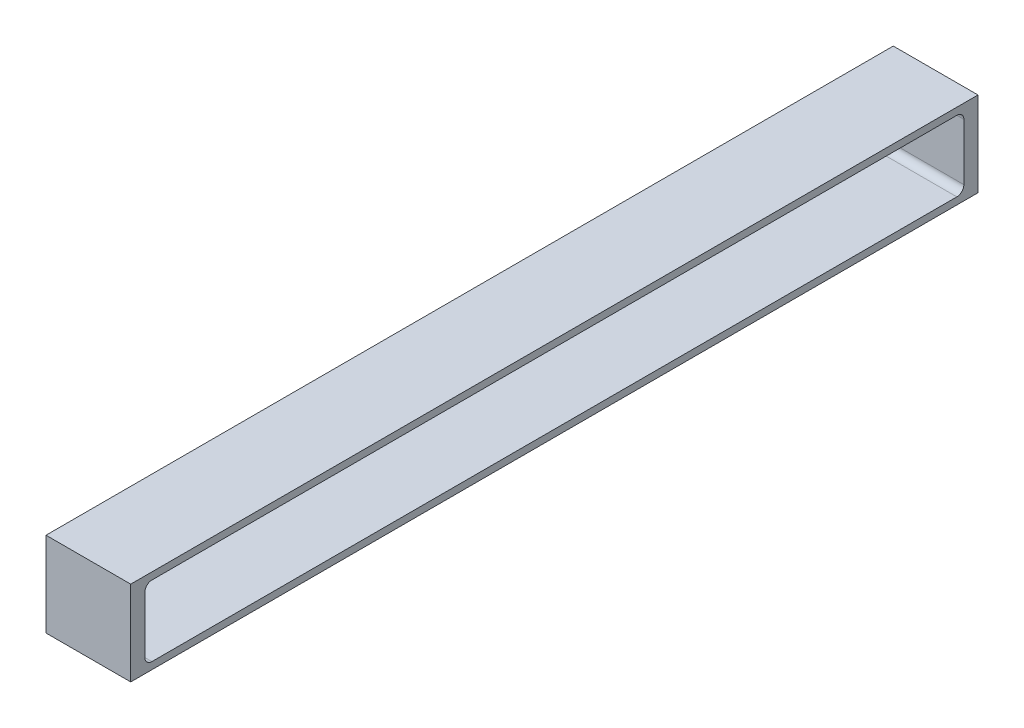
ISO-10303-21;
HEADER;
FILE_DESCRIPTION(('STEP AP214'),'2;1');
FILE_NAME('part.step','',(''),(''),'','','');
FILE_SCHEMA(('AUTOMOTIVE_DESIGN { 1 0 10303 214 1 1 1 1 }'));
ENDSEC;
DATA;
#1=APPLICATION_CONTEXT('core data for automotive mechanical design processes');
#2=APPLICATION_PROTOCOL_DEFINITION('international standard','automotive_design',2000,#1);
#3=PRODUCT_CONTEXT('',#1,'mechanical');
#4=PRODUCT('Part','Part','',(#3));
#5=PRODUCT_RELATED_PRODUCT_CATEGORY('part','',(#4));
#6=PRODUCT_DEFINITION_FORMATION('','',#4);
#7=PRODUCT_DEFINITION_CONTEXT('part definition',#1,'design');
#8=PRODUCT_DEFINITION('design','',#6,#7);
#9=PRODUCT_DEFINITION_SHAPE('','',#8);
#10=(LENGTH_UNIT() NAMED_UNIT(*) SI_UNIT(.MILLI.,.METRE.));
#11=(NAMED_UNIT(*) PLANE_ANGLE_UNIT() SI_UNIT($,.RADIAN.));
#12=(NAMED_UNIT(*) SI_UNIT($,.STERADIAN.) SOLID_ANGLE_UNIT());
#13=UNCERTAINTY_MEASURE_WITH_UNIT(LENGTH_MEASURE(1.E-05),#10,'distance_accuracy_value','');
#14=(GEOMETRIC_REPRESENTATION_CONTEXT(3) GLOBAL_UNCERTAINTY_ASSIGNED_CONTEXT((#13)) GLOBAL_UNIT_ASSIGNED_CONTEXT((#10,
#11,#12)) REPRESENTATION_CONTEXT('',''));
#15=CARTESIAN_POINT('',(0.,0.,0.));
#16=DIRECTION('',(0.,0.,1.));
#17=DIRECTION('',(1.,0.,0.));
#18=AXIS2_PLACEMENT_3D('',#15,#16,#17);
#19=CARTESIAN_POINT('',(0.,0.,381.));
#20=DIRECTION('',(1.,0.,0.));
#21=DIRECTION('',(0.,0.,-1.));
#22=AXIS2_PLACEMENT_3D('',#19,#20,#21);
#23=PLANE('',#22);
#24=DIRECTION('',(0.,-1.,0.));
#25=VECTOR('',#24,1.);
#26=CARTESIAN_POINT('',(0.,0.,0.));
#27=LINE('',#26,#25);
#28=CARTESIAN_POINT('',(0.,38.1,0.));
#29=VERTEX_POINT('',#28);
#30=CARTESIAN_POINT('',(0.,0.,0.));
#31=VERTEX_POINT('',#30);
#32=EDGE_CURVE('E146',#29,#31,#27,.T.);
#33=ORIENTED_EDGE('',*,*,#32,.T.);
#34=DIRECTION('',(0.,0.,-1.));
#35=VECTOR('',#34,1.);
#36=CARTESIAN_POINT('',(0.,0.,381.));
#37=LINE('',#36,#35);
#38=CARTESIAN_POINT('',(0.,0.,381.));
#39=VERTEX_POINT('',#38);
#40=EDGE_CURVE('E127',#39,#31,#37,.T.);
#41=ORIENTED_EDGE('',*,*,#40,.F.);
#42=DIRECTION('',(0.,-1.,0.));
#43=VECTOR('',#42,1.);
#44=CARTESIAN_POINT('',(0.,0.,381.));
#45=LINE('',#44,#43);
#46=CARTESIAN_POINT('',(0.,38.1,381.));
#47=VERTEX_POINT('',#46);
#48=EDGE_CURVE('E134',#47,#39,#45,.T.);
#49=ORIENTED_EDGE('',*,*,#48,.F.);
#50=DIRECTION('',(0.,0.,-1.));
#51=VECTOR('',#50,1.);
#52=CARTESIAN_POINT('',(0.,38.1,381.));
#53=LINE('',#52,#51);
#54=EDGE_CURVE('E220',#47,#29,#53,.T.);
#55=ORIENTED_EDGE('',*,*,#54,.T.);
#56=EDGE_LOOP('',(#33,#41,#49,#55));
#57=FACE_BOUND('',#56,.T.);
#58=ADVANCED_FACE('F35',(#57),#23,.F.);
#59=CARTESIAN_POINT('',(0.,0.,381.));
#60=DIRECTION('',(0.,1.,0.));
#61=DIRECTION('',(0.,0.,1.));
#62=AXIS2_PLACEMENT_3D('',#59,#60,#61);
#63=PLANE('',#62);
#64=DIRECTION('',(1.,0.,0.));
#65=VECTOR('',#64,1.);
#66=CARTESIAN_POINT('',(0.,0.,0.));
#67=LINE('',#66,#65);
#68=CARTESIAN_POINT('',(38.1,0.,0.));
#69=VERTEX_POINT('',#68);
#70=EDGE_CURVE('E211',#31,#69,#67,.T.);
#71=ORIENTED_EDGE('',*,*,#70,.T.);
#72=DIRECTION('',(0.,0.,-1.));
#73=VECTOR('',#72,1.);
#74=CARTESIAN_POINT('',(38.1,0.,381.));
#75=LINE('',#74,#73);
#76=CARTESIAN_POINT('',(38.1,0.,381.));
#77=VERTEX_POINT('',#76);
#78=EDGE_CURVE('E130',#77,#69,#75,.T.);
#79=ORIENTED_EDGE('',*,*,#78,.F.);
#80=DIRECTION('',(1.,0.,0.));
#81=VECTOR('',#80,1.);
#82=CARTESIAN_POINT('',(0.,0.,381.));
#83=LINE('',#82,#81);
#84=EDGE_CURVE('E123',#39,#77,#83,.T.);
#85=ORIENTED_EDGE('',*,*,#84,.F.);
#86=ORIENTED_EDGE('',*,*,#40,.T.);
#87=EDGE_LOOP('',(#71,#79,#85,#86));
#88=FACE_BOUND('',#87,.T.);
#89=ADVANCED_FACE('F125',(#88),#63,.F.);
#90=CARTESIAN_POINT('',(38.1,0.,381.));
#91=DIRECTION('',(-1.,0.,0.));
#92=DIRECTION('',(0.,0.,1.));
#93=AXIS2_PLACEMENT_3D('',#90,#91,#92);
#94=PLANE('',#93);
#95=DIRECTION('',(0.,0.,-1.));
#96=VECTOR('',#95,1.);
#97=CARTESIAN_POINT('',(38.1,3.17499999999998,374.65));
#98=LINE('',#97,#96);
#99=CARTESIAN_POINT('',(38.1,3.17499999999998,371.475));
#100=VERTEX_POINT('',#99);
#101=CARTESIAN_POINT('',(38.1,3.17499999999998,9.52500000000006));
#102=VERTEX_POINT('',#101);
#103=EDGE_CURVE('E188',#100,#102,#98,.T.);
#104=ORIENTED_EDGE('',*,*,#103,.F.);
#105=CARTESIAN_POINT('',(38.1,6.34999999999998,371.475));
#106=DIRECTION('',(-1.,0.,0.));
#107=DIRECTION('',(0.,0.,1.));
#108=AXIS2_PLACEMENT_3D('',#105,#106,#107);
#109=CIRCLE('',#108,3.175);
#110=CARTESIAN_POINT('',(38.1,6.34999999999998,374.65));
#111=VERTEX_POINT('',#110);
#112=EDGE_CURVE('E181',#100,#111,#109,.T.);
#113=ORIENTED_EDGE('',*,*,#112,.T.);
#114=DIRECTION('',(0.,-1.,0.));
#115=VECTOR('',#114,1.);
#116=CARTESIAN_POINT('',(38.1,34.925,374.65));
#117=LINE('',#116,#115);
#118=CARTESIAN_POINT('',(38.1,31.75,374.65));
#119=VERTEX_POINT('',#118);
#120=EDGE_CURVE('E186',#119,#111,#117,.T.);
#121=ORIENTED_EDGE('',*,*,#120,.F.);
#122=CARTESIAN_POINT('',(38.1,31.75,371.475));
#123=DIRECTION('',(-1.,0.,0.));
#124=DIRECTION('',(0.,0.,1.));
#125=AXIS2_PLACEMENT_3D('',#122,#123,#124);
#126=CIRCLE('',#125,3.175);
#127=CARTESIAN_POINT('',(38.1,34.925,371.475));
#128=VERTEX_POINT('',#127);
#129=EDGE_CURVE('E43',#119,#128,#126,.T.);
#130=ORIENTED_EDGE('',*,*,#129,.T.);
#131=DIRECTION('',(0.,0.,1.));
#132=VECTOR('',#131,1.);
#133=CARTESIAN_POINT('',(38.1,34.925,374.65));
#134=LINE('',#133,#132);
#135=CARTESIAN_POINT('',(38.1,34.925,9.52500000000006));
#136=VERTEX_POINT('',#135);
#137=EDGE_CURVE('E216',#136,#128,#134,.T.);
#138=ORIENTED_EDGE('',*,*,#137,.F.);
#139=CARTESIAN_POINT('',(38.1,31.75,9.52499999999995));
#140=DIRECTION('',(-1.,0.,0.));
#141=DIRECTION('',(0.,0.,1.));
#142=AXIS2_PLACEMENT_3D('',#139,#140,#141);
#143=CIRCLE('',#142,3.175);
#144=CARTESIAN_POINT('',(38.1,31.75,6.34999999999997));
#145=VERTEX_POINT('',#144);
#146=EDGE_CURVE('E12',#136,#145,#143,.T.);
#147=ORIENTED_EDGE('',*,*,#146,.T.);
#148=DIRECTION('',(0.,1.,0.));
#149=VECTOR('',#148,1.);
#150=CARTESIAN_POINT('',(38.1,34.925,6.34999999999997));
#151=LINE('',#150,#149);
#152=CARTESIAN_POINT('',(38.1,6.34999999999998,6.34999999999997));
#153=VERTEX_POINT('',#152);
#154=EDGE_CURVE('E270',#153,#145,#151,.T.);
#155=ORIENTED_EDGE('',*,*,#154,.F.);
#156=CARTESIAN_POINT('',(38.1,6.34999999999998,9.52499999999997));
#157=DIRECTION('',(-1.,0.,0.));
#158=DIRECTION('',(0.,0.,1.));
#159=AXIS2_PLACEMENT_3D('',#156,#157,#158);
#160=CIRCLE('',#159,3.175);
#161=EDGE_CURVE('E179',#153,#102,#160,.T.);
#162=ORIENTED_EDGE('',*,*,#161,.T.);
#163=EDGE_LOOP('',(#104,#113,#121,#130,#138,#147,#155,#162));
#164=FACE_BOUND('',#163,.T.);
#165=DIRECTION('',(0.,1.,0.));
#166=VECTOR('',#165,1.);
#167=CARTESIAN_POINT('',(38.1,0.,0.));
#168=LINE('',#167,#166);
#169=CARTESIAN_POINT('',(38.1,38.1,0.));
#170=VERTEX_POINT('',#169);
#171=EDGE_CURVE('E223',#69,#170,#168,.T.);
#172=ORIENTED_EDGE('',*,*,#171,.T.);
#173=DIRECTION('',(0.,0.,-1.));
#174=VECTOR('',#173,1.);
#175=CARTESIAN_POINT('',(38.1,38.1,381.));
#176=LINE('',#175,#174);
#177=CARTESIAN_POINT('',(38.1,38.1,381.));
#178=VERTEX_POINT('',#177);
#179=EDGE_CURVE('E151',#178,#170,#176,.T.);
#180=ORIENTED_EDGE('',*,*,#179,.F.);
#181=DIRECTION('',(0.,1.,0.));
#182=VECTOR('',#181,1.);
#183=CARTESIAN_POINT('',(38.1,0.,381.));
#184=LINE('',#183,#182);
#185=EDGE_CURVE('E133',#77,#178,#184,.T.);
#186=ORIENTED_EDGE('',*,*,#185,.F.);
#187=ORIENTED_EDGE('',*,*,#78,.T.);
#188=EDGE_LOOP('',(#172,#180,#186,#187));
#189=FACE_BOUND('',#188,.T.);
#190=ADVANCED_FACE('F184',(#164,#189),#94,.F.);
#191=CARTESIAN_POINT('',(0.,38.1,381.));
#192=DIRECTION('',(0.,-1.,0.));
#193=DIRECTION('',(0.,0.,-1.));
#194=AXIS2_PLACEMENT_3D('',#191,#192,#193);
#195=PLANE('',#194);
#196=DIRECTION('',(-1.,0.,0.));
#197=VECTOR('',#196,1.);
#198=CARTESIAN_POINT('',(0.,38.1,0.));
#199=LINE('',#198,#197);
#200=EDGE_CURVE('E143',#170,#29,#199,.T.);
#201=ORIENTED_EDGE('',*,*,#200,.T.);
#202=ORIENTED_EDGE('',*,*,#54,.F.);
#203=DIRECTION('',(-1.,0.,0.));
#204=VECTOR('',#203,1.);
#205=CARTESIAN_POINT('',(0.,38.1,381.));
#206=LINE('',#205,#204);
#207=EDGE_CURVE('E139',#178,#47,#206,.T.);
#208=ORIENTED_EDGE('',*,*,#207,.F.);
#209=ORIENTED_EDGE('',*,*,#179,.T.);
#210=EDGE_LOOP('',(#201,#202,#208,#209));
#211=FACE_BOUND('',#210,.T.);
#212=ADVANCED_FACE('F230',(#211),#195,.F.);
#213=CARTESIAN_POINT('',(0.,0.,381.));
#214=DIRECTION('',(0.,0.,-1.));
#215=DIRECTION('',(-1.,0.,0.));
#216=AXIS2_PLACEMENT_3D('',#213,#214,#215);
#217=PLANE('',#216);
#218=ORIENTED_EDGE('',*,*,#48,.T.);
#219=ORIENTED_EDGE('',*,*,#84,.T.);
#220=ORIENTED_EDGE('',*,*,#185,.T.);
#221=ORIENTED_EDGE('',*,*,#207,.T.);
#222=EDGE_LOOP('',(#218,#219,#220,#221));
#223=FACE_BOUND('',#222,.T.);
#224=ADVANCED_FACE('F137',(#223),#217,.F.);
#225=CARTESIAN_POINT('',(0.,0.,0.));
#226=DIRECTION('',(0.,0.,-1.));
#227=DIRECTION('',(-1.,0.,0.));
#228=AXIS2_PLACEMENT_3D('',#225,#226,#227);
#229=PLANE('',#228);
#230=ORIENTED_EDGE('',*,*,#32,.F.);
#231=ORIENTED_EDGE('',*,*,#200,.F.);
#232=ORIENTED_EDGE('',*,*,#171,.F.);
#233=ORIENTED_EDGE('',*,*,#70,.F.);
#234=EDGE_LOOP('',(#230,#231,#232,#233));
#235=FACE_BOUND('',#234,.T.);
#236=ADVANCED_FACE('F233',(#235),#229,.T.);
#237=CARTESIAN_POINT('',(-369.666001276828,34.925,374.65));
#238=DIRECTION('',(0.,0.,1.));
#239=DIRECTION('',(1.,0.,0.));
#240=AXIS2_PLACEMENT_3D('',#237,#238,#239);
#241=PLANE('',#240);
#242=ORIENTED_EDGE('',*,*,#120,.T.);
#243=DIRECTION('',(1.,0.,0.));
#244=VECTOR('',#243,1.);
#245=CARTESIAN_POINT('',(4.7625,6.34999999999998,374.65));
#246=LINE('',#245,#244);
#247=CARTESIAN_POINT('',(4.7625,6.34999999999998,374.65));
#248=VERTEX_POINT('',#247);
#249=EDGE_CURVE('E173',#111,#248,#246,.F.);
#250=ORIENTED_EDGE('',*,*,#249,.T.);
#251=DIRECTION('',(0.,1.,0.));
#252=VECTOR('',#251,1.);
#253=CARTESIAN_POINT('',(4.7625,34.925,374.65));
#254=LINE('',#253,#252);
#255=CARTESIAN_POINT('',(4.7625,31.75,374.65));
#256=VERTEX_POINT('',#255);
#257=EDGE_CURVE('E206',#248,#256,#254,.T.);
#258=ORIENTED_EDGE('',*,*,#257,.T.);
#259=DIRECTION('',(1.,0.,0.));
#260=VECTOR('',#259,1.);
#261=CARTESIAN_POINT('',(38.1,31.75,374.65));
#262=LINE('',#261,#260);
#263=EDGE_CURVE('E170',#256,#119,#262,.T.);
#264=ORIENTED_EDGE('',*,*,#263,.T.);
#265=EDGE_LOOP('',(#242,#250,#258,#264));
#266=FACE_BOUND('',#265,.T.);
#267=ADVANCED_FACE('F193',(#266),#241,.F.);
#268=CARTESIAN_POINT('',(-369.666001276828,34.925,374.65));
#269=DIRECTION('',(0.,1.,0.));
#270=DIRECTION('',(0.,0.,1.));
#271=AXIS2_PLACEMENT_3D('',#268,#269,#270);
#272=PLANE('',#271);
#273=ORIENTED_EDGE('',*,*,#137,.T.);
#274=DIRECTION('',(1.,0.,0.));
#275=VECTOR('',#274,1.);
#276=CARTESIAN_POINT('',(4.7625,34.925,371.475));
#277=LINE('',#276,#275);
#278=CARTESIAN_POINT('',(4.7625,34.925,371.475));
#279=VERTEX_POINT('',#278);
#280=EDGE_CURVE('E177',#128,#279,#277,.F.);
#281=ORIENTED_EDGE('',*,*,#280,.T.);
#282=DIRECTION('',(0.,0.,-1.));
#283=VECTOR('',#282,1.);
#284=CARTESIAN_POINT('',(4.7625,34.925,374.65));
#285=LINE('',#284,#283);
#286=CARTESIAN_POINT('',(4.7625,34.925,9.52499999999995));
#287=VERTEX_POINT('',#286);
#288=EDGE_CURVE('E213',#279,#287,#285,.T.);
#289=ORIENTED_EDGE('',*,*,#288,.T.);
#290=DIRECTION('',(1.,0.,0.));
#291=VECTOR('',#290,1.);
#292=CARTESIAN_POINT('',(38.1,34.925,9.52499999999995));
#293=LINE('',#292,#291);
#294=EDGE_CURVE('E175',#287,#136,#293,.T.);
#295=ORIENTED_EDGE('',*,*,#294,.T.);
#296=EDGE_LOOP('',(#273,#281,#289,#295));
#297=FACE_BOUND('',#296,.T.);
#298=ADVANCED_FACE('F274',(#297),#272,.F.);
#299=CARTESIAN_POINT('',(-369.666001276828,34.925,6.34999999999997));
#300=DIRECTION('',(0.,0.,-1.));
#301=DIRECTION('',(-1.,0.,0.));
#302=AXIS2_PLACEMENT_3D('',#299,#300,#301);
#303=PLANE('',#302);
#304=DIRECTION('',(0.,-1.,0.));
#305=VECTOR('',#304,1.);
#306=CARTESIAN_POINT('',(4.7625,34.925,6.34999999999997));
#307=LINE('',#306,#305);
#308=CARTESIAN_POINT('',(4.7625,31.75,6.34999999999997));
#309=VERTEX_POINT('',#308);
#310=CARTESIAN_POINT('',(4.7625,6.34999999999998,6.34999999999997));
#311=VERTEX_POINT('',#310);
#312=EDGE_CURVE('E265',#309,#311,#307,.T.);
#313=ORIENTED_EDGE('',*,*,#312,.T.);
#314=DIRECTION('',(1.,0.,0.));
#315=VECTOR('',#314,1.);
#316=CARTESIAN_POINT('',(38.1,6.34999999999998,6.34999999999997));
#317=LINE('',#316,#315);
#318=EDGE_CURVE('E149',#311,#153,#317,.T.);
#319=ORIENTED_EDGE('',*,*,#318,.T.);
#320=ORIENTED_EDGE('',*,*,#154,.T.);
#321=DIRECTION('',(1.,0.,0.));
#322=VECTOR('',#321,1.);
#323=CARTESIAN_POINT('',(4.7625,31.75,6.34999999999997));
#324=LINE('',#323,#322);
#325=EDGE_CURVE('E147',#145,#309,#324,.F.);
#326=ORIENTED_EDGE('',*,*,#325,.T.);
#327=EDGE_LOOP('',(#313,#319,#320,#326));
#328=FACE_BOUND('',#327,.T.);
#329=ADVANCED_FACE('F276',(#328),#303,.F.);
#330=CARTESIAN_POINT('',(-369.666001276828,3.17499999999998,374.65));
#331=DIRECTION('',(0.,-1.,0.));
#332=DIRECTION('',(0.,0.,-1.));
#333=AXIS2_PLACEMENT_3D('',#330,#331,#332);
#334=PLANE('',#333);
#335=ORIENTED_EDGE('',*,*,#103,.T.);
#336=DIRECTION('',(1.,0.,0.));
#337=VECTOR('',#336,1.);
#338=CARTESIAN_POINT('',(4.7625,3.17499999999998,9.52499999999997));
#339=LINE('',#338,#337);
#340=CARTESIAN_POINT('',(4.7625,3.17499999999998,9.52499999999995));
#341=VERTEX_POINT('',#340);
#342=EDGE_CURVE('E160',#102,#341,#339,.F.);
#343=ORIENTED_EDGE('',*,*,#342,.T.);
#344=DIRECTION('',(0.,0.,1.));
#345=VECTOR('',#344,1.);
#346=CARTESIAN_POINT('',(4.7625,3.17499999999998,374.65));
#347=LINE('',#346,#345);
#348=CARTESIAN_POINT('',(4.7625,3.17499999999998,371.475));
#349=VERTEX_POINT('',#348);
#350=EDGE_CURVE('E204',#341,#349,#347,.T.);
#351=ORIENTED_EDGE('',*,*,#350,.T.);
#352=DIRECTION('',(1.,0.,0.));
#353=VECTOR('',#352,1.);
#354=CARTESIAN_POINT('',(38.1,3.17499999999998,371.475));
#355=LINE('',#354,#353);
#356=EDGE_CURVE('E157',#349,#100,#355,.T.);
#357=ORIENTED_EDGE('',*,*,#356,.T.);
#358=EDGE_LOOP('',(#335,#343,#351,#357));
#359=FACE_BOUND('',#358,.T.);
#360=ADVANCED_FACE('F208',(#359),#334,.F.);
#361=CARTESIAN_POINT('',(4.7625,0.,381.));
#362=DIRECTION('',(1.,0.,0.));
#363=DIRECTION('',(0.,0.,-1.));
#364=AXIS2_PLACEMENT_3D('',#361,#362,#363);
#365=PLANE('',#364);
#366=ORIENTED_EDGE('',*,*,#350,.F.);
#367=CARTESIAN_POINT('',(4.7625,6.34999999999998,9.52499999999997));
#368=DIRECTION('',(1.,0.,0.));
#369=DIRECTION('',(0.,0.,-1.));
#370=AXIS2_PLACEMENT_3D('',#367,#368,#369);
#371=CIRCLE('',#370,3.175);
#372=EDGE_CURVE('E168',#341,#311,#371,.T.);
#373=ORIENTED_EDGE('',*,*,#372,.T.);
#374=ORIENTED_EDGE('',*,*,#312,.F.);
#375=CARTESIAN_POINT('',(4.7625,31.75,9.52499999999995));
#376=DIRECTION('',(1.,0.,0.));
#377=DIRECTION('',(0.,0.,-1.));
#378=AXIS2_PLACEMENT_3D('',#375,#376,#377);
#379=CIRCLE('',#378,3.175);
#380=EDGE_CURVE('E162',#309,#287,#379,.T.);
#381=ORIENTED_EDGE('',*,*,#380,.T.);
#382=ORIENTED_EDGE('',*,*,#288,.F.);
#383=CARTESIAN_POINT('',(4.7625,31.75,371.475));
#384=DIRECTION('',(1.,0.,0.));
#385=DIRECTION('',(0.,0.,-1.));
#386=AXIS2_PLACEMENT_3D('',#383,#384,#385);
#387=CIRCLE('',#386,3.175);
#388=EDGE_CURVE('E164',#279,#256,#387,.T.);
#389=ORIENTED_EDGE('',*,*,#388,.T.);
#390=ORIENTED_EDGE('',*,*,#257,.F.);
#391=CARTESIAN_POINT('',(4.7625,6.34999999999998,371.475));
#392=DIRECTION('',(1.,0.,0.));
#393=DIRECTION('',(0.,0.,-1.));
#394=AXIS2_PLACEMENT_3D('',#391,#392,#393);
#395=CIRCLE('',#394,3.175);
#396=EDGE_CURVE('E166',#248,#349,#395,.T.);
#397=ORIENTED_EDGE('',*,*,#396,.T.);
#398=EDGE_LOOP('',(#366,#373,#374,#381,#382,#389,#390,#397));
#399=FACE_BOUND('',#398,.T.);
#400=ADVANCED_FACE('F203',(#399),#365,.T.);
#401=CARTESIAN_POINT('',(-369.666001276828,6.34999999999998,9.52499999999997));
#402=DIRECTION('',(-1.,0.,0.));
#403=DIRECTION('',(0.,0.,1.));
#404=AXIS2_PLACEMENT_3D('',#401,#402,#403);
#405=CYLINDRICAL_SURFACE('',#404,3.175);
#406=ORIENTED_EDGE('',*,*,#372,.F.);
#407=ORIENTED_EDGE('',*,*,#342,.F.);
#408=ORIENTED_EDGE('',*,*,#161,.F.);
#409=ORIENTED_EDGE('',*,*,#318,.F.);
#410=EDGE_LOOP('',(#406,#407,#408,#409));
#411=FACE_BOUND('',#410,.T.);
#412=ADVANCED_FACE('F247',(#411),#405,.F.);
#413=CARTESIAN_POINT('',(-369.666001276828,6.34999999999998,371.475));
#414=DIRECTION('',(-1.,0.,0.));
#415=DIRECTION('',(0.,0.,1.));
#416=AXIS2_PLACEMENT_3D('',#413,#414,#415);
#417=CYLINDRICAL_SURFACE('',#416,3.175);
#418=ORIENTED_EDGE('',*,*,#396,.F.);
#419=ORIENTED_EDGE('',*,*,#249,.F.);
#420=ORIENTED_EDGE('',*,*,#112,.F.);
#421=ORIENTED_EDGE('',*,*,#356,.F.);
#422=EDGE_LOOP('',(#418,#419,#420,#421));
#423=FACE_BOUND('',#422,.T.);
#424=ADVANCED_FACE('F199',(#423),#417,.F.);
#425=CARTESIAN_POINT('',(-369.666001276828,31.75,371.475));
#426=DIRECTION('',(-1.,0.,0.));
#427=DIRECTION('',(0.,0.,1.));
#428=AXIS2_PLACEMENT_3D('',#425,#426,#427);
#429=CYLINDRICAL_SURFACE('',#428,3.175);
#430=ORIENTED_EDGE('',*,*,#388,.F.);
#431=ORIENTED_EDGE('',*,*,#280,.F.);
#432=ORIENTED_EDGE('',*,*,#129,.F.);
#433=ORIENTED_EDGE('',*,*,#263,.F.);
#434=EDGE_LOOP('',(#430,#431,#432,#433));
#435=FACE_BOUND('',#434,.T.);
#436=ADVANCED_FACE('F252',(#435),#429,.F.);
#437=CARTESIAN_POINT('',(-369.666001276828,31.75,9.52499999999995));
#438=DIRECTION('',(-1.,0.,0.));
#439=DIRECTION('',(0.,0.,1.));
#440=AXIS2_PLACEMENT_3D('',#437,#438,#439);
#441=CYLINDRICAL_SURFACE('',#440,3.175);
#442=ORIENTED_EDGE('',*,*,#380,.F.);
#443=ORIENTED_EDGE('',*,*,#325,.F.);
#444=ORIENTED_EDGE('',*,*,#146,.F.);
#445=ORIENTED_EDGE('',*,*,#294,.F.);
#446=EDGE_LOOP('',(#442,#443,#444,#445));
#447=FACE_BOUND('',#446,.T.);
#448=ADVANCED_FACE('F37',(#447),#441,.F.);
#449=CLOSED_SHELL('',(#58,#89,#190,#212,#224,#236,#267,#298,#329,#360,#400,#412,#424,#436,#448));
#450=MANIFOLD_SOLID_BREP('B2',#449);
#451=ADVANCED_BREP_SHAPE_REPRESENTATION('',(#18,#450),#14);
#452=SHAPE_DEFINITION_REPRESENTATION(#9,#451);
ENDSEC;
END-ISO-10303-21;
